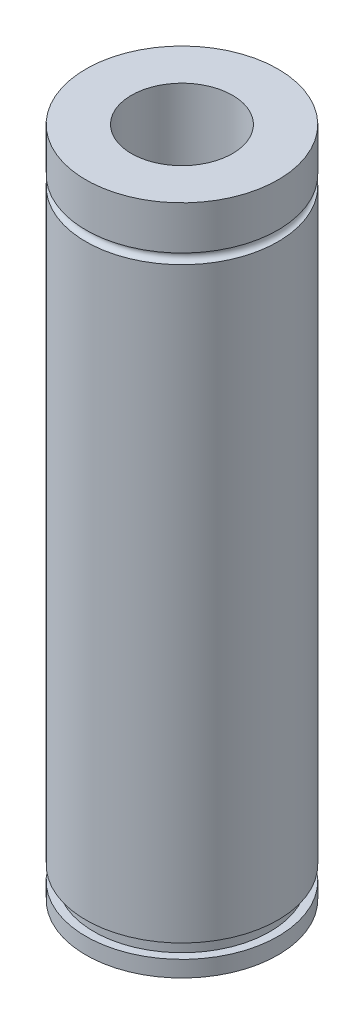
ISO-10303-21;
HEADER;
FILE_DESCRIPTION(('STEP AP214'),'2;1');
FILE_NAME('part.step','',(''),(''),'','','');
FILE_SCHEMA(('AUTOMOTIVE_DESIGN { 1 0 10303 214 1 1 1 1 }'));
ENDSEC;
DATA;
#1=APPLICATION_CONTEXT('core data for automotive mechanical design processes');
#2=APPLICATION_PROTOCOL_DEFINITION('international standard','automotive_design',2000,#1);
#3=PRODUCT_CONTEXT('',#1,'mechanical');
#4=PRODUCT('Part','Part','',(#3));
#5=PRODUCT_RELATED_PRODUCT_CATEGORY('part','',(#4));
#6=PRODUCT_DEFINITION_FORMATION('','',#4);
#7=PRODUCT_DEFINITION_CONTEXT('part definition',#1,'design');
#8=PRODUCT_DEFINITION('design','',#6,#7);
#9=PRODUCT_DEFINITION_SHAPE('','',#8);
#10=(LENGTH_UNIT() NAMED_UNIT(*) SI_UNIT(.MILLI.,.METRE.));
#11=(NAMED_UNIT(*) PLANE_ANGLE_UNIT() SI_UNIT($,.RADIAN.));
#12=(NAMED_UNIT(*) SI_UNIT($,.STERADIAN.) SOLID_ANGLE_UNIT());
#13=UNCERTAINTY_MEASURE_WITH_UNIT(LENGTH_MEASURE(1.E-05),#10,'distance_accuracy_value','');
#14=(GEOMETRIC_REPRESENTATION_CONTEXT(3) GLOBAL_UNCERTAINTY_ASSIGNED_CONTEXT((#13)) GLOBAL_UNIT_ASSIGNED_CONTEXT((#10,
#11,#12)) REPRESENTATION_CONTEXT('',''));
#15=CARTESIAN_POINT('',(0.,0.,0.));
#16=DIRECTION('',(0.,0.,1.));
#17=DIRECTION('',(1.,0.,0.));
#18=AXIS2_PLACEMENT_3D('',#15,#16,#17);
#19=CARTESIAN_POINT('',(0.,0.,0.));
#20=DIRECTION('',(0.,-1.,0.));
#21=DIRECTION('',(0.,0.,-1.));
#22=AXIS2_PLACEMENT_3D('',#19,#20,#21);
#23=PLANE('',#22);
#24=CARTESIAN_POINT('',(0.,0.,0.));
#25=DIRECTION('',(0.,-1.,0.));
#26=DIRECTION('',(0.,0.,-1.));
#27=AXIS2_PLACEMENT_3D('',#24,#25,#26);
#28=CIRCLE('',#27,47.5);
#29=CARTESIAN_POINT('',(0.,0.,-47.5));
#30=VERTEX_POINT('',#29);
#31=EDGE_CURVE('E10',#30,#30,#28,.T.);
#32=ORIENTED_EDGE('',*,*,#31,.T.);
#33=EDGE_LOOP('',(#32));
#34=FACE_BOUND('',#33,.T.);
#35=ADVANCED_FACE('F31',(#34),#23,.T.);
#36=CARTESIAN_POINT('',(0.,0.,0.));
#37=DIRECTION('',(0.,-1.,0.));
#38=DIRECTION('',(0.,0.,-1.));
#39=AXIS2_PLACEMENT_3D('',#36,#37,#38);
#40=CYLINDRICAL_SURFACE('',#39,47.5);
#41=CARTESIAN_POINT('',(0.,8.00000000000001,0.));
#42=DIRECTION('',(0.,-1.,0.));
#43=DIRECTION('',(0.,0.,-1.));
#44=AXIS2_PLACEMENT_3D('',#41,#42,#43);
#45=CIRCLE('',#44,47.5);
#46=CARTESIAN_POINT('',(0.,8.00000000000001,-47.5));
#47=VERTEX_POINT('',#46);
#48=EDGE_CURVE('E37',#47,#47,#45,.T.);
#49=ORIENTED_EDGE('',*,*,#48,.T.);
#50=EDGE_LOOP('',(#49));
#51=FACE_BOUND('',#50,.T.);
#52=ORIENTED_EDGE('',*,*,#31,.F.);
#53=EDGE_LOOP('',(#52));
#54=FACE_BOUND('',#53,.T.);
#55=ADVANCED_FACE('F81',(#51,#54),#40,.T.);
#56=CARTESIAN_POINT('',(47.5,8.,0.));
#57=DIRECTION('',(0.,1.,0.));
#58=DIRECTION('',(0.,0.,1.));
#59=AXIS2_PLACEMENT_3D('',#56,#57,#58);
#60=PLANE('',#59);
#61=CARTESIAN_POINT('',(0.,8.,0.));
#62=DIRECTION('',(0.,-1.,0.));
#63=DIRECTION('',(0.,0.,-1.));
#64=AXIS2_PLACEMENT_3D('',#61,#62,#63);
#65=CIRCLE('',#64,43.5);
#66=CARTESIAN_POINT('',(0.,8.,-43.5));
#67=VERTEX_POINT('',#66);
#68=EDGE_CURVE('E41',#67,#67,#65,.T.);
#69=ORIENTED_EDGE('',*,*,#68,.T.);
#70=EDGE_LOOP('',(#69));
#71=FACE_BOUND('',#70,.T.);
#72=ORIENTED_EDGE('',*,*,#48,.F.);
#73=EDGE_LOOP('',(#72));
#74=FACE_BOUND('',#73,.T.);
#75=ADVANCED_FACE('F85',(#71,#74),#60,.T.);
#76=CARTESIAN_POINT('',(0.,0.,0.));
#77=DIRECTION('',(0.,-1.,0.));
#78=DIRECTION('',(0.,0.,-1.));
#79=AXIS2_PLACEMENT_3D('',#76,#77,#78);
#80=CYLINDRICAL_SURFACE('',#79,43.5);
#81=CARTESIAN_POINT('',(0.,15.,0.));
#82=DIRECTION('',(0.,-1.,0.));
#83=DIRECTION('',(0.,0.,-1.));
#84=AXIS2_PLACEMENT_3D('',#81,#82,#83);
#85=CIRCLE('',#84,43.5);
#86=CARTESIAN_POINT('',(0.,15.,-43.5));
#87=VERTEX_POINT('',#86);
#88=EDGE_CURVE('E45',#87,#87,#85,.T.);
#89=ORIENTED_EDGE('',*,*,#88,.T.);
#90=EDGE_LOOP('',(#89));
#91=FACE_BOUND('',#90,.T.);
#92=ORIENTED_EDGE('',*,*,#68,.F.);
#93=EDGE_LOOP('',(#92));
#94=FACE_BOUND('',#93,.T.);
#95=ADVANCED_FACE('F89',(#91,#94),#80,.T.);
#96=CARTESIAN_POINT('',(43.5,15.,0.));
#97=DIRECTION('',(0.,-1.,0.));
#98=DIRECTION('',(0.,0.,-1.));
#99=AXIS2_PLACEMENT_3D('',#96,#97,#98);
#100=PLANE('',#99);
#101=CARTESIAN_POINT('',(0.,15.,0.));
#102=DIRECTION('',(0.,-1.,0.));
#103=DIRECTION('',(0.,0.,-1.));
#104=AXIS2_PLACEMENT_3D('',#101,#102,#103);
#105=CIRCLE('',#104,47.5);
#106=CARTESIAN_POINT('',(0.,15.,-47.5));
#107=VERTEX_POINT('',#106);
#108=EDGE_CURVE('E50',#107,#107,#105,.T.);
#109=ORIENTED_EDGE('',*,*,#108,.T.);
#110=EDGE_LOOP('',(#109));
#111=FACE_BOUND('',#110,.T.);
#112=ORIENTED_EDGE('',*,*,#88,.F.);
#113=EDGE_LOOP('',(#112));
#114=FACE_BOUND('',#113,.T.);
#115=ADVANCED_FACE('F96',(#111,#114),#100,.T.);
#116=CARTESIAN_POINT('',(0.,0.,0.));
#117=DIRECTION('',(0.,-1.,0.));
#118=DIRECTION('',(0.,0.,-1.));
#119=AXIS2_PLACEMENT_3D('',#116,#117,#118);
#120=CYLINDRICAL_SURFACE('',#119,47.5);
#121=CARTESIAN_POINT('',(0.,305.5,0.));
#122=DIRECTION('',(0.,-1.,0.));
#123=DIRECTION('',(0.,0.,-1.));
#124=AXIS2_PLACEMENT_3D('',#121,#122,#123);
#125=CIRCLE('',#124,47.5);
#126=CARTESIAN_POINT('',(0.,305.5,-47.5));
#127=VERTEX_POINT('',#126);
#128=EDGE_CURVE('E53',#127,#127,#125,.T.);
#129=ORIENTED_EDGE('',*,*,#128,.T.);
#130=EDGE_LOOP('',(#129));
#131=FACE_BOUND('',#130,.T.);
#132=ORIENTED_EDGE('',*,*,#108,.F.);
#133=EDGE_LOOP('',(#132));
#134=FACE_BOUND('',#133,.T.);
#135=ADVANCED_FACE('F100',(#131,#134),#120,.T.);
#136=CARTESIAN_POINT('',(0.,308.,0.));
#137=DIRECTION('',(0.,-1.,0.));
#138=DIRECTION('',(0.,0.,-1.));
#139=AXIS2_PLACEMENT_3D('',#136,#137,#138);
#140=TOROIDAL_SURFACE('',#139,47.5,2.5);
#141=CARTESIAN_POINT('',(0.,310.5,0.));
#142=DIRECTION('',(0.,-1.,0.));
#143=DIRECTION('',(0.,0.,-1.));
#144=AXIS2_PLACEMENT_3D('',#141,#142,#143);
#145=CIRCLE('',#144,47.5);
#146=CARTESIAN_POINT('',(0.,310.5,-47.5));
#147=VERTEX_POINT('',#146);
#148=EDGE_CURVE('E56',#147,#147,#145,.T.);
#149=ORIENTED_EDGE('',*,*,#148,.T.);
#150=EDGE_LOOP('',(#149));
#151=FACE_BOUND('',#150,.T.);
#152=ORIENTED_EDGE('',*,*,#128,.F.);
#153=EDGE_LOOP('',(#152));
#154=FACE_BOUND('',#153,.T.);
#155=ADVANCED_FACE('F104',(#151,#154),#140,.F.);
#156=CARTESIAN_POINT('',(0.,0.,0.));
#157=DIRECTION('',(0.,-1.,0.));
#158=DIRECTION('',(0.,0.,-1.));
#159=AXIS2_PLACEMENT_3D('',#156,#157,#158);
#160=CYLINDRICAL_SURFACE('',#159,47.5);
#161=CARTESIAN_POINT('',(0.,332.,0.));
#162=DIRECTION('',(0.,-1.,0.));
#163=DIRECTION('',(0.,0.,-1.));
#164=AXIS2_PLACEMENT_3D('',#161,#162,#163);
#165=CIRCLE('',#164,47.5);
#166=CARTESIAN_POINT('',(0.,332.,-47.5));
#167=VERTEX_POINT('',#166);
#168=EDGE_CURVE('E59',#167,#167,#165,.T.);
#169=ORIENTED_EDGE('',*,*,#168,.T.);
#170=EDGE_LOOP('',(#169));
#171=FACE_BOUND('',#170,.T.);
#172=ORIENTED_EDGE('',*,*,#148,.F.);
#173=EDGE_LOOP('',(#172));
#174=FACE_BOUND('',#173,.T.);
#175=ADVANCED_FACE('F108',(#171,#174),#160,.T.);
#176=CARTESIAN_POINT('',(47.5,332.,0.));
#177=DIRECTION('',(0.,1.,0.));
#178=DIRECTION('',(0.,0.,1.));
#179=AXIS2_PLACEMENT_3D('',#176,#177,#178);
#180=PLANE('',#179);
#181=CARTESIAN_POINT('',(0.,332.,0.));
#182=DIRECTION('',(0.,-1.,0.));
#183=DIRECTION('',(0.,0.,-1.));
#184=AXIS2_PLACEMENT_3D('',#181,#182,#183);
#185=CIRCLE('',#184,25.);
#186=CARTESIAN_POINT('',(0.,332.,-25.));
#187=VERTEX_POINT('',#186);
#188=EDGE_CURVE('E62',#187,#187,#185,.T.);
#189=ORIENTED_EDGE('',*,*,#188,.T.);
#190=EDGE_LOOP('',(#189));
#191=FACE_BOUND('',#190,.T.);
#192=ORIENTED_EDGE('',*,*,#168,.F.);
#193=EDGE_LOOP('',(#192));
#194=FACE_BOUND('',#193,.T.);
#195=ADVANCED_FACE('F78',(#191,#194),#180,.T.);
#196=CARTESIAN_POINT('',(0.,0.,0.));
#197=DIRECTION('',(0.,-1.,0.));
#198=DIRECTION('',(0.,0.,-1.));
#199=AXIS2_PLACEMENT_3D('',#196,#197,#198);
#200=CYLINDRICAL_SURFACE('',#199,25.);
#201=CARTESIAN_POINT('',(0.,82.,0.));
#202=DIRECTION('',(0.,-1.,0.));
#203=DIRECTION('',(0.,0.,-1.));
#204=AXIS2_PLACEMENT_3D('',#201,#202,#203);
#205=CIRCLE('',#204,25.);
#206=CARTESIAN_POINT('',(0.,82.,-25.));
#207=VERTEX_POINT('',#206);
#208=EDGE_CURVE('E65',#207,#207,#205,.T.);
#209=ORIENTED_EDGE('',*,*,#208,.T.);
#210=EDGE_LOOP('',(#209));
#211=FACE_BOUND('',#210,.T.);
#212=ORIENTED_EDGE('',*,*,#188,.F.);
#213=EDGE_LOOP('',(#212));
#214=FACE_BOUND('',#213,.T.);
#215=ADVANCED_FACE('F69',(#211,#214),#200,.F.);
#216=CARTESIAN_POINT('',(25.,82.,0.));
#217=DIRECTION('',(0.,1.,0.));
#218=DIRECTION('',(0.,0.,1.));
#219=AXIS2_PLACEMENT_3D('',#216,#217,#218);
#220=PLANE('',#219);
#221=ORIENTED_EDGE('',*,*,#208,.F.);
#222=EDGE_LOOP('',(#221));
#223=FACE_BOUND('',#222,.T.);
#224=ADVANCED_FACE('F72',(#223),#220,.T.);
#225=CLOSED_SHELL('',(#35,#55,#75,#95,#115,#135,#155,#175,#195,#215,#224));
#226=MANIFOLD_SOLID_BREP('B2',#225);
#227=ADVANCED_BREP_SHAPE_REPRESENTATION('',(#18,#226),#14);
#228=SHAPE_DEFINITION_REPRESENTATION(#9,#227);
ENDSEC;
END-ISO-10303-21;
